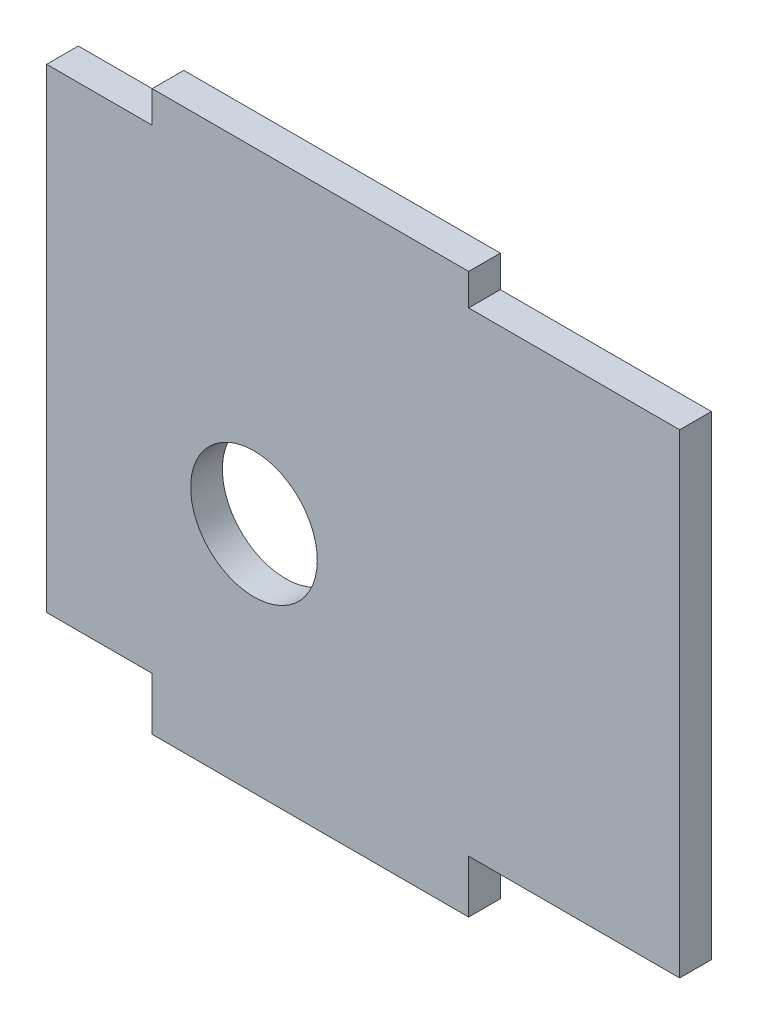
ISO-10303-21;
HEADER;
FILE_DESCRIPTION(('STEP AP214'),'2;1');
FILE_NAME('part.step','',(''),(''),'','','');
FILE_SCHEMA(('AUTOMOTIVE_DESIGN { 1 0 10303 214 1 1 1 1 }'));
ENDSEC;
DATA;
#1=APPLICATION_CONTEXT('core data for automotive mechanical design processes');
#2=APPLICATION_PROTOCOL_DEFINITION('international standard','automotive_design',2000,#1);
#3=PRODUCT_CONTEXT('',#1,'mechanical');
#4=PRODUCT('Part','Part','',(#3));
#5=PRODUCT_RELATED_PRODUCT_CATEGORY('part','',(#4));
#6=PRODUCT_DEFINITION_FORMATION('','',#4);
#7=PRODUCT_DEFINITION_CONTEXT('part definition',#1,'design');
#8=PRODUCT_DEFINITION('design','',#6,#7);
#9=PRODUCT_DEFINITION_SHAPE('','',#8);
#10=(LENGTH_UNIT() NAMED_UNIT(*) SI_UNIT(.MILLI.,.METRE.));
#11=(NAMED_UNIT(*) PLANE_ANGLE_UNIT() SI_UNIT($,.RADIAN.));
#12=(NAMED_UNIT(*) SI_UNIT($,.STERADIAN.) SOLID_ANGLE_UNIT());
#13=UNCERTAINTY_MEASURE_WITH_UNIT(LENGTH_MEASURE(1.E-05),#10,'distance_accuracy_value','');
#14=(GEOMETRIC_REPRESENTATION_CONTEXT(3) GLOBAL_UNCERTAINTY_ASSIGNED_CONTEXT((#13)) GLOBAL_UNIT_ASSIGNED_CONTEXT((#10,
#11,#12)) REPRESENTATION_CONTEXT('',''));
#15=CARTESIAN_POINT('',(0.,0.,0.));
#16=DIRECTION('',(0.,0.,1.));
#17=DIRECTION('',(1.,0.,0.));
#18=AXIS2_PLACEMENT_3D('',#15,#16,#17);
#19=CARTESIAN_POINT('',(47.5,3.,3.));
#20=DIRECTION('',(-1.,0.,0.));
#21=DIRECTION('',(0.,-1.,0.));
#22=AXIS2_PLACEMENT_3D('',#19,#20,#21);
#23=PLANE('',#22);
#24=DIRECTION('',(0.,0.,1.));
#25=VECTOR('',#24,1.);
#26=CARTESIAN_POINT('',(47.5,0.,-49.2442890089805));
#27=LINE('',#26,#25);
#28=CARTESIAN_POINT('',(47.5,0.,0.));
#29=VERTEX_POINT('',#28);
#30=CARTESIAN_POINT('',(47.5,0.,3.));
#31=VERTEX_POINT('',#30);
#32=EDGE_CURVE('E63',#29,#31,#27,.T.);
#33=ORIENTED_EDGE('',*,*,#32,.F.);
#34=DIRECTION('',(0.,1.,0.));
#35=VECTOR('',#34,1.);
#36=CARTESIAN_POINT('',(47.5,3.,0.));
#37=LINE('',#36,#35);
#38=CARTESIAN_POINT('',(47.5,3.,0.));
#39=VERTEX_POINT('',#38);
#40=EDGE_CURVE('E222',#29,#39,#37,.T.);
#41=ORIENTED_EDGE('',*,*,#40,.T.);
#42=DIRECTION('',(0.,0.,-1.));
#43=VECTOR('',#42,1.);
#44=CARTESIAN_POINT('',(47.5,3.,3.));
#45=LINE('',#44,#43);
#46=CARTESIAN_POINT('',(47.5,3.,3.));
#47=VERTEX_POINT('',#46);
#48=EDGE_CURVE('E237',#47,#39,#45,.T.);
#49=ORIENTED_EDGE('',*,*,#48,.F.);
#50=DIRECTION('',(0.,1.,0.));
#51=VECTOR('',#50,1.);
#52=CARTESIAN_POINT('',(47.5,3.,3.));
#53=LINE('',#52,#51);
#54=EDGE_CURVE('E273',#31,#47,#53,.T.);
#55=ORIENTED_EDGE('',*,*,#54,.F.);
#56=EDGE_LOOP('',(#33,#41,#49,#55));
#57=FACE_BOUND('',#56,.T.);
#58=ADVANCED_FACE('F38',(#57),#23,.F.);
#59=CARTESIAN_POINT('',(17.5,3.,3.));
#60=DIRECTION('',(1.,0.,0.));
#61=DIRECTION('',(0.,0.,-1.));
#62=AXIS2_PLACEMENT_3D('',#59,#60,#61);
#63=PLANE('',#62);
#64=DIRECTION('',(0.,0.,1.));
#65=VECTOR('',#64,1.);
#66=CARTESIAN_POINT('',(17.5,-45.,-49.2442890089805));
#67=LINE('',#66,#65);
#68=CARTESIAN_POINT('',(17.5,-45.,0.));
#69=VERTEX_POINT('',#68);
#70=CARTESIAN_POINT('',(17.5,-45.,3.));
#71=VERTEX_POINT('',#70);
#72=EDGE_CURVE('E169',#69,#71,#67,.T.);
#73=ORIENTED_EDGE('',*,*,#72,.F.);
#74=DIRECTION('',(0.,-1.,0.));
#75=VECTOR('',#74,1.);
#76=CARTESIAN_POINT('',(17.5,3.,0.));
#77=LINE('',#76,#75);
#78=CARTESIAN_POINT('',(17.5,-50.,0.));
#79=VERTEX_POINT('',#78);
#80=EDGE_CURVE('E197',#69,#79,#77,.T.);
#81=ORIENTED_EDGE('',*,*,#80,.T.);
#82=DIRECTION('',(0.,0.,-1.));
#83=VECTOR('',#82,1.);
#84=CARTESIAN_POINT('',(17.5,-50.,3.));
#85=LINE('',#84,#83);
#86=CARTESIAN_POINT('',(17.5,-50.,3.));
#87=VERTEX_POINT('',#86);
#88=EDGE_CURVE('E11',#87,#79,#85,.T.);
#89=ORIENTED_EDGE('',*,*,#88,.F.);
#90=DIRECTION('',(0.,-1.,0.));
#91=VECTOR('',#90,1.);
#92=CARTESIAN_POINT('',(17.5,3.,3.));
#93=LINE('',#92,#91);
#94=EDGE_CURVE('E183',#71,#87,#93,.T.);
#95=ORIENTED_EDGE('',*,*,#94,.F.);
#96=EDGE_LOOP('',(#73,#81,#89,#95));
#97=FACE_BOUND('',#96,.T.);
#98=ADVANCED_FACE('F296',(#97),#63,.F.);
#99=CARTESIAN_POINT('',(17.5,3.,0.));
#100=VERTEX_POINT('',#99);
#101=CARTESIAN_POINT('',(17.5,0.,0.));
#102=VERTEX_POINT('',#101);
#103=EDGE_CURVE('E214',#100,#102,#77,.T.);
#104=ORIENTED_EDGE('',*,*,#103,.T.);
#105=DIRECTION('',(0.,0.,1.));
#106=VECTOR('',#105,1.);
#107=CARTESIAN_POINT('',(17.5,0.,-49.2442890089805));
#108=LINE('',#107,#106);
#109=CARTESIAN_POINT('',(17.5,0.,3.));
#110=VERTEX_POINT('',#109);
#111=EDGE_CURVE('E188',#102,#110,#108,.T.);
#112=ORIENTED_EDGE('',*,*,#111,.T.);
#113=CARTESIAN_POINT('',(17.5,3.,3.));
#114=VERTEX_POINT('',#113);
#115=EDGE_CURVE('E210',#114,#110,#93,.T.);
#116=ORIENTED_EDGE('',*,*,#115,.F.);
#117=DIRECTION('',(0.,0.,-1.));
#118=VECTOR('',#117,1.);
#119=CARTESIAN_POINT('',(17.5,3.,3.));
#120=LINE('',#119,#118);
#121=EDGE_CURVE('E246',#114,#100,#120,.T.);
#122=ORIENTED_EDGE('',*,*,#121,.T.);
#123=EDGE_LOOP('',(#104,#112,#116,#122));
#124=FACE_BOUND('',#123,.T.);
#125=ADVANCED_FACE('F40',(#124),#63,.F.);
#126=CARTESIAN_POINT('',(17.5,-50.,3.));
#127=DIRECTION('',(0.,1.,0.));
#128=DIRECTION('',(0.,0.,1.));
#129=AXIS2_PLACEMENT_3D('',#126,#127,#128);
#130=PLANE('',#129);
#131=DIRECTION('',(1.,0.,0.));
#132=VECTOR('',#131,1.);
#133=CARTESIAN_POINT('',(17.5,-50.,0.));
#134=LINE('',#133,#132);
#135=CARTESIAN_POINT('',(47.5,-50.,0.));
#136=VERTEX_POINT('',#135);
#137=EDGE_CURVE('E219',#79,#136,#134,.T.);
#138=ORIENTED_EDGE('',*,*,#137,.T.);
#139=DIRECTION('',(0.,0.,-1.));
#140=VECTOR('',#139,1.);
#141=CARTESIAN_POINT('',(47.5,-50.,3.));
#142=LINE('',#141,#140);
#143=CARTESIAN_POINT('',(47.5,-50.,3.));
#144=VERTEX_POINT('',#143);
#145=EDGE_CURVE('E47',#144,#136,#142,.T.);
#146=ORIENTED_EDGE('',*,*,#145,.F.);
#147=DIRECTION('',(1.,0.,0.));
#148=VECTOR('',#147,1.);
#149=CARTESIAN_POINT('',(17.5,-50.,3.));
#150=LINE('',#149,#148);
#151=EDGE_CURVE('E207',#87,#144,#150,.T.);
#152=ORIENTED_EDGE('',*,*,#151,.F.);
#153=ORIENTED_EDGE('',*,*,#88,.T.);
#154=EDGE_LOOP('',(#138,#146,#152,#153));
#155=FACE_BOUND('',#154,.T.);
#156=ADVANCED_FACE('F303',(#155),#130,.F.);
#157=CARTESIAN_POINT('',(47.5,-45.,0.));
#158=VERTEX_POINT('',#157);
#159=EDGE_CURVE('E231',#136,#158,#37,.T.);
#160=ORIENTED_EDGE('',*,*,#159,.T.);
#161=DIRECTION('',(0.,0.,1.));
#162=VECTOR('',#161,1.);
#163=CARTESIAN_POINT('',(47.5,-45.,-49.2442890089805));
#164=LINE('',#163,#162);
#165=CARTESIAN_POINT('',(47.5,-45.,3.));
#166=VERTEX_POINT('',#165);
#167=EDGE_CURVE('E55',#158,#166,#164,.T.);
#168=ORIENTED_EDGE('',*,*,#167,.T.);
#169=EDGE_CURVE('E153',#144,#166,#53,.T.);
#170=ORIENTED_EDGE('',*,*,#169,.F.);
#171=ORIENTED_EDGE('',*,*,#145,.T.);
#172=EDGE_LOOP('',(#160,#168,#170,#171));
#173=FACE_BOUND('',#172,.T.);
#174=ADVANCED_FACE('F256',(#173),#23,.F.);
#175=CARTESIAN_POINT('',(17.5,3.,3.));
#176=DIRECTION('',(0.,-1.,0.));
#177=DIRECTION('',(0.,0.,-1.));
#178=AXIS2_PLACEMENT_3D('',#175,#176,#177);
#179=PLANE('',#178);
#180=DIRECTION('',(-1.,0.,0.));
#181=VECTOR('',#180,1.);
#182=CARTESIAN_POINT('',(17.5,3.,0.));
#183=LINE('',#182,#181);
#184=EDGE_CURVE('E225',#39,#100,#183,.T.);
#185=ORIENTED_EDGE('',*,*,#184,.T.);
#186=ORIENTED_EDGE('',*,*,#121,.F.);
#187=DIRECTION('',(-1.,0.,0.));
#188=VECTOR('',#187,1.);
#189=CARTESIAN_POINT('',(17.5,3.,3.));
#190=LINE('',#189,#188);
#191=EDGE_CURVE('E218',#47,#114,#190,.T.);
#192=ORIENTED_EDGE('',*,*,#191,.F.);
#193=ORIENTED_EDGE('',*,*,#48,.T.);
#194=EDGE_LOOP('',(#185,#186,#192,#193));
#195=FACE_BOUND('',#194,.T.);
#196=ADVANCED_FACE('F243',(#195),#179,.F.);
#197=CARTESIAN_POINT('',(0.,0.,3.));
#198=DIRECTION('',(0.,0.,1.));
#199=DIRECTION('',(1.,0.,0.));
#200=AXIS2_PLACEMENT_3D('',#197,#198,#199);
#201=PLANE('',#200);
#202=CARTESIAN_POINT('',(27.15,-27.9,3.));
#203=DIRECTION('',(0.,0.,1.));
#204=DIRECTION('',(1.,0.,0.));
#205=AXIS2_PLACEMENT_3D('',#202,#203,#204);
#206=CIRCLE('',#205,6.00000000000001);
#207=CARTESIAN_POINT('',(33.15,-27.9,3.));
#208=VERTEX_POINT('',#207);
#209=EDGE_CURVE('E156',#208,#208,#206,.T.);
#210=ORIENTED_EDGE('',*,*,#209,.F.);
#211=EDGE_LOOP('',(#210));
#212=FACE_BOUND('',#211,.T.);
#213=ORIENTED_EDGE('',*,*,#115,.T.);
#214=DIRECTION('',(-1.,0.,0.));
#215=VECTOR('',#214,1.);
#216=CARTESIAN_POINT('',(17.5,0.,3.));
#217=LINE('',#216,#215);
#218=CARTESIAN_POINT('',(7.49999999999997,0.,3.));
#219=VERTEX_POINT('',#218);
#220=EDGE_CURVE('E174',#110,#219,#217,.T.);
#221=ORIENTED_EDGE('',*,*,#220,.T.);
#222=DIRECTION('',(0.,-1.,0.));
#223=VECTOR('',#222,1.);
#224=CARTESIAN_POINT('',(7.49999999999997,0.,3.));
#225=LINE('',#224,#223);
#226=CARTESIAN_POINT('',(7.49999999999998,-45.,3.));
#227=VERTEX_POINT('',#226);
#228=EDGE_CURVE('E170',#219,#227,#225,.T.);
#229=ORIENTED_EDGE('',*,*,#228,.T.);
#230=DIRECTION('',(1.,0.,0.));
#231=VECTOR('',#230,1.);
#232=CARTESIAN_POINT('',(17.5,-45.,3.));
#233=LINE('',#232,#231);
#234=EDGE_CURVE('E173',#227,#71,#233,.T.);
#235=ORIENTED_EDGE('',*,*,#234,.T.);
#236=ORIENTED_EDGE('',*,*,#94,.T.);
#237=ORIENTED_EDGE('',*,*,#151,.T.);
#238=ORIENTED_EDGE('',*,*,#169,.T.);
#239=DIRECTION('',(1.,0.,0.));
#240=VECTOR('',#239,1.);
#241=CARTESIAN_POINT('',(47.5,-45.,3.));
#242=LINE('',#241,#240);
#243=CARTESIAN_POINT('',(67.5,-45.,3.));
#244=VERTEX_POINT('',#243);
#245=EDGE_CURVE('E135',#166,#244,#242,.T.);
#246=ORIENTED_EDGE('',*,*,#245,.T.);
#247=DIRECTION('',(0.,1.,0.));
#248=VECTOR('',#247,1.);
#249=CARTESIAN_POINT('',(67.5,0.,3.));
#250=LINE('',#249,#248);
#251=CARTESIAN_POINT('',(67.5,0.,3.));
#252=VERTEX_POINT('',#251);
#253=EDGE_CURVE('E143',#244,#252,#250,.T.);
#254=ORIENTED_EDGE('',*,*,#253,.T.);
#255=DIRECTION('',(-1.,0.,0.));
#256=VECTOR('',#255,1.);
#257=CARTESIAN_POINT('',(47.5,0.,3.));
#258=LINE('',#257,#256);
#259=EDGE_CURVE('E149',#252,#31,#258,.T.);
#260=ORIENTED_EDGE('',*,*,#259,.T.);
#261=ORIENTED_EDGE('',*,*,#54,.T.);
#262=ORIENTED_EDGE('',*,*,#191,.T.);
#263=EDGE_LOOP('',(#213,#221,#229,#235,#236,#237,#238,#246,#254,#260,#261,#262));
#264=FACE_BOUND('',#263,.T.);
#265=ADVANCED_FACE('F152',(#212,#264),#201,.T.);
#266=CARTESIAN_POINT('',(0.,0.,0.));
#267=DIRECTION('',(0.,0.,1.));
#268=DIRECTION('',(1.,0.,0.));
#269=AXIS2_PLACEMENT_3D('',#266,#267,#268);
#270=PLANE('',#269);
#271=CARTESIAN_POINT('',(27.15,-27.9,0.));
#272=DIRECTION('',(0.,0.,1.));
#273=DIRECTION('',(1.,0.,0.));
#274=AXIS2_PLACEMENT_3D('',#271,#272,#273);
#275=CIRCLE('',#274,6.00000000000001);
#276=CARTESIAN_POINT('',(33.15,-27.9,0.));
#277=VERTEX_POINT('',#276);
#278=EDGE_CURVE('E42',#277,#277,#275,.T.);
#279=ORIENTED_EDGE('',*,*,#278,.T.);
#280=EDGE_LOOP('',(#279));
#281=FACE_BOUND('',#280,.T.);
#282=ORIENTED_EDGE('',*,*,#103,.F.);
#283=ORIENTED_EDGE('',*,*,#184,.F.);
#284=ORIENTED_EDGE('',*,*,#40,.F.);
#285=DIRECTION('',(1.,0.,0.));
#286=VECTOR('',#285,1.);
#287=CARTESIAN_POINT('',(47.5,0.,0.));
#288=LINE('',#287,#286);
#289=CARTESIAN_POINT('',(67.5,0.,0.));
#290=VERTEX_POINT('',#289);
#291=EDGE_CURVE('E262',#29,#290,#288,.T.);
#292=ORIENTED_EDGE('',*,*,#291,.T.);
#293=DIRECTION('',(0.,-1.,0.));
#294=VECTOR('',#293,1.);
#295=CARTESIAN_POINT('',(67.5,0.,0.));
#296=LINE('',#295,#294);
#297=CARTESIAN_POINT('',(67.5,-45.,0.));
#298=VERTEX_POINT('',#297);
#299=EDGE_CURVE('E261',#290,#298,#296,.T.);
#300=ORIENTED_EDGE('',*,*,#299,.T.);
#301=DIRECTION('',(-1.,0.,0.));
#302=VECTOR('',#301,1.);
#303=CARTESIAN_POINT('',(47.5,-45.,0.));
#304=LINE('',#303,#302);
#305=EDGE_CURVE('E137',#298,#158,#304,.T.);
#306=ORIENTED_EDGE('',*,*,#305,.T.);
#307=ORIENTED_EDGE('',*,*,#159,.F.);
#308=ORIENTED_EDGE('',*,*,#137,.F.);
#309=ORIENTED_EDGE('',*,*,#80,.F.);
#310=DIRECTION('',(-1.,0.,0.));
#311=VECTOR('',#310,1.);
#312=CARTESIAN_POINT('',(17.5,-45.,0.));
#313=LINE('',#312,#311);
#314=CARTESIAN_POINT('',(7.49999999999998,-45.,0.));
#315=VERTEX_POINT('',#314);
#316=EDGE_CURVE('E168',#69,#315,#313,.T.);
#317=ORIENTED_EDGE('',*,*,#316,.T.);
#318=DIRECTION('',(0.,1.,0.));
#319=VECTOR('',#318,1.);
#320=CARTESIAN_POINT('',(7.49999999999997,0.,0.));
#321=LINE('',#320,#319);
#322=CARTESIAN_POINT('',(7.49999999999997,0.,0.));
#323=VERTEX_POINT('',#322);
#324=EDGE_CURVE('E166',#315,#323,#321,.T.);
#325=ORIENTED_EDGE('',*,*,#324,.T.);
#326=DIRECTION('',(1.,0.,0.));
#327=VECTOR('',#326,1.);
#328=CARTESIAN_POINT('',(17.5,0.,0.));
#329=LINE('',#328,#327);
#330=EDGE_CURVE('E192',#323,#102,#329,.T.);
#331=ORIENTED_EDGE('',*,*,#330,.T.);
#332=EDGE_LOOP('',(#282,#283,#284,#292,#300,#306,#307,#308,#309,#317,#325,#331));
#333=FACE_BOUND('',#332,.T.);
#334=ADVANCED_FACE('F249',(#281,#333),#270,.F.);
#335=CARTESIAN_POINT('',(17.5,-45.,-49.2442890089805));
#336=DIRECTION('',(0.,-1.,0.));
#337=DIRECTION('',(0.,0.,-1.));
#338=AXIS2_PLACEMENT_3D('',#335,#336,#337);
#339=PLANE('',#338);
#340=ORIENTED_EDGE('',*,*,#316,.F.);
#341=ORIENTED_EDGE('',*,*,#72,.T.);
#342=ORIENTED_EDGE('',*,*,#234,.F.);
#343=DIRECTION('',(0.,0.,1.));
#344=VECTOR('',#343,1.);
#345=CARTESIAN_POINT('',(7.49999999999998,-45.,-49.2442890089805));
#346=LINE('',#345,#344);
#347=EDGE_CURVE('E177',#315,#227,#346,.T.);
#348=ORIENTED_EDGE('',*,*,#347,.F.);
#349=EDGE_LOOP('',(#340,#341,#342,#348));
#350=FACE_BOUND('',#349,.T.);
#351=ADVANCED_FACE('F289',(#350),#339,.T.);
#352=CARTESIAN_POINT('',(7.49999999999997,0.,-49.2442890089805));
#353=DIRECTION('',(-1.,0.,0.));
#354=DIRECTION('',(0.,-1.,0.));
#355=AXIS2_PLACEMENT_3D('',#352,#353,#354);
#356=PLANE('',#355);
#357=ORIENTED_EDGE('',*,*,#324,.F.);
#358=ORIENTED_EDGE('',*,*,#347,.T.);
#359=ORIENTED_EDGE('',*,*,#228,.F.);
#360=DIRECTION('',(0.,0.,1.));
#361=VECTOR('',#360,1.);
#362=CARTESIAN_POINT('',(7.49999999999997,0.,-49.2442890089805));
#363=LINE('',#362,#361);
#364=EDGE_CURVE('E202',#323,#219,#363,.T.);
#365=ORIENTED_EDGE('',*,*,#364,.F.);
#366=EDGE_LOOP('',(#357,#358,#359,#365));
#367=FACE_BOUND('',#366,.T.);
#368=ADVANCED_FACE('F322',(#367),#356,.T.);
#369=CARTESIAN_POINT('',(17.5,0.,-49.2442890089805));
#370=DIRECTION('',(0.,1.,0.));
#371=DIRECTION('',(-1.,0.,0.));
#372=AXIS2_PLACEMENT_3D('',#369,#370,#371);
#373=PLANE('',#372);
#374=ORIENTED_EDGE('',*,*,#330,.F.);
#375=ORIENTED_EDGE('',*,*,#364,.T.);
#376=ORIENTED_EDGE('',*,*,#220,.F.);
#377=ORIENTED_EDGE('',*,*,#111,.F.);
#378=EDGE_LOOP('',(#374,#375,#376,#377));
#379=FACE_BOUND('',#378,.T.);
#380=ADVANCED_FACE('F321',(#379),#373,.T.);
#381=CARTESIAN_POINT('',(47.5,0.,-49.2442890089805));
#382=DIRECTION('',(0.,1.,0.));
#383=DIRECTION('',(0.,0.,1.));
#384=AXIS2_PLACEMENT_3D('',#381,#382,#383);
#385=PLANE('',#384);
#386=ORIENTED_EDGE('',*,*,#291,.F.);
#387=ORIENTED_EDGE('',*,*,#32,.T.);
#388=ORIENTED_EDGE('',*,*,#259,.F.);
#389=DIRECTION('',(0.,0.,1.));
#390=VECTOR('',#389,1.);
#391=CARTESIAN_POINT('',(67.5,0.,-49.2442890089805));
#392=LINE('',#391,#390);
#393=EDGE_CURVE('E140',#290,#252,#392,.T.);
#394=ORIENTED_EDGE('',*,*,#393,.F.);
#395=EDGE_LOOP('',(#386,#387,#388,#394));
#396=FACE_BOUND('',#395,.T.);
#397=ADVANCED_FACE('F326',(#396),#385,.T.);
#398=CARTESIAN_POINT('',(67.5,0.,-49.2442890089805));
#399=DIRECTION('',(1.,0.,0.));
#400=DIRECTION('',(0.,0.,-1.));
#401=AXIS2_PLACEMENT_3D('',#398,#399,#400);
#402=PLANE('',#401);
#403=ORIENTED_EDGE('',*,*,#299,.F.);
#404=ORIENTED_EDGE('',*,*,#393,.T.);
#405=ORIENTED_EDGE('',*,*,#253,.F.);
#406=DIRECTION('',(0.,0.,1.));
#407=VECTOR('',#406,1.);
#408=CARTESIAN_POINT('',(67.5,-45.,-49.2442890089805));
#409=LINE('',#408,#407);
#410=EDGE_CURVE('E131',#298,#244,#409,.T.);
#411=ORIENTED_EDGE('',*,*,#410,.F.);
#412=EDGE_LOOP('',(#403,#404,#405,#411));
#413=FACE_BOUND('',#412,.T.);
#414=ADVANCED_FACE('F144',(#413),#402,.T.);
#415=CARTESIAN_POINT('',(47.5,-45.,-49.2442890089805));
#416=DIRECTION('',(0.,-1.,0.));
#417=DIRECTION('',(0.,0.,-1.));
#418=AXIS2_PLACEMENT_3D('',#415,#416,#417);
#419=PLANE('',#418);
#420=ORIENTED_EDGE('',*,*,#305,.F.);
#421=ORIENTED_EDGE('',*,*,#410,.T.);
#422=ORIENTED_EDGE('',*,*,#245,.F.);
#423=ORIENTED_EDGE('',*,*,#167,.F.);
#424=EDGE_LOOP('',(#420,#421,#422,#423));
#425=FACE_BOUND('',#424,.T.);
#426=ADVANCED_FACE('F133',(#425),#419,.T.);
#427=CARTESIAN_POINT('',(27.15,-27.9,-5.00000000001367E-05));
#428=DIRECTION('',(0.,0.,1.));
#429=DIRECTION('',(1.,0.,0.));
#430=AXIS2_PLACEMENT_3D('',#427,#428,#429);
#431=CYLINDRICAL_SURFACE('',#430,6.00000000000001);
#432=CARTESIAN_POINT('',(33.15,-27.9,3.));
#433=CARTESIAN_POINT('',(33.15,-27.9,2.96875));
#434=CARTESIAN_POINT('',(33.15,-27.9,2.9375));
#435=CARTESIAN_POINT('',(33.15,-27.9,2.875));
#436=CARTESIAN_POINT('',(33.15,-27.9,2.84375));
#437=CARTESIAN_POINT('',(33.15,-27.9,2.78125));
#438=CARTESIAN_POINT('',(33.15,-27.9,2.75));
#439=CARTESIAN_POINT('',(33.15,-27.9,2.6875));
#440=CARTESIAN_POINT('',(33.15,-27.9,2.65625));
#441=CARTESIAN_POINT('',(33.15,-27.9,2.59375));
#442=CARTESIAN_POINT('',(33.15,-27.9,2.5625));
#443=CARTESIAN_POINT('',(33.15,-27.9,2.5));
#444=CARTESIAN_POINT('',(33.15,-27.9,2.46875));
#445=CARTESIAN_POINT('',(33.15,-27.9,2.40625));
#446=CARTESIAN_POINT('',(33.15,-27.9,2.375));
#447=CARTESIAN_POINT('',(33.15,-27.9,2.3125));
#448=CARTESIAN_POINT('',(33.15,-27.9,2.28125));
#449=CARTESIAN_POINT('',(33.15,-27.9,2.21875));
#450=CARTESIAN_POINT('',(33.15,-27.9,2.1875));
#451=CARTESIAN_POINT('',(33.15,-27.9,2.125));
#452=CARTESIAN_POINT('',(33.15,-27.9,2.09375));
#453=CARTESIAN_POINT('',(33.15,-27.9,2.03125));
#454=CARTESIAN_POINT('',(33.15,-27.9,2.));
#455=CARTESIAN_POINT('',(33.15,-27.9,1.9375));
#456=CARTESIAN_POINT('',(33.15,-27.9,1.90625));
#457=CARTESIAN_POINT('',(33.15,-27.9,1.84375));
#458=CARTESIAN_POINT('',(33.15,-27.9,1.8125));
#459=CARTESIAN_POINT('',(33.15,-27.9,1.75));
#460=CARTESIAN_POINT('',(33.15,-27.9,1.71875));
#461=CARTESIAN_POINT('',(33.15,-27.9,1.65625));
#462=CARTESIAN_POINT('',(33.15,-27.9,1.625));
#463=CARTESIAN_POINT('',(33.15,-27.9,1.5625));
#464=CARTESIAN_POINT('',(33.15,-27.9,1.53125));
#465=CARTESIAN_POINT('',(33.15,-27.9,1.46875));
#466=CARTESIAN_POINT('',(33.15,-27.9,1.4375));
#467=CARTESIAN_POINT('',(33.15,-27.9,1.375));
#468=CARTESIAN_POINT('',(33.15,-27.9,1.34375));
#469=CARTESIAN_POINT('',(33.15,-27.9,1.28125));
#470=CARTESIAN_POINT('',(33.15,-27.9,1.25));
#471=CARTESIAN_POINT('',(33.15,-27.9,1.1875));
#472=CARTESIAN_POINT('',(33.15,-27.9,1.15625));
#473=CARTESIAN_POINT('',(33.15,-27.9,1.09375));
#474=CARTESIAN_POINT('',(33.15,-27.9,1.0625));
#475=CARTESIAN_POINT('',(33.15,-27.9,1.));
#476=CARTESIAN_POINT('',(33.15,-27.9,0.96875));
#477=CARTESIAN_POINT('',(33.15,-27.9,0.90625));
#478=CARTESIAN_POINT('',(33.15,-27.9,0.875));
#479=CARTESIAN_POINT('',(33.15,-27.9,0.8125));
#480=CARTESIAN_POINT('',(33.15,-27.9,0.78125));
#481=CARTESIAN_POINT('',(33.15,-27.9,0.71875));
#482=CARTESIAN_POINT('',(33.15,-27.9,0.6875));
#483=CARTESIAN_POINT('',(33.15,-27.9,0.625));
#484=CARTESIAN_POINT('',(33.15,-27.9,0.59375));
#485=CARTESIAN_POINT('',(33.15,-27.9,0.53125));
#486=CARTESIAN_POINT('',(33.15,-27.9,0.5));
#487=CARTESIAN_POINT('',(33.15,-27.9,0.4375));
#488=CARTESIAN_POINT('',(33.15,-27.9,0.40625));
#489=CARTESIAN_POINT('',(33.15,-27.9,0.34375));
#490=CARTESIAN_POINT('',(33.15,-27.9,0.3125));
#491=CARTESIAN_POINT('',(33.15,-27.9,0.25));
#492=CARTESIAN_POINT('',(33.15,-27.9,0.21875));
#493=CARTESIAN_POINT('',(33.15,-27.9,0.15625));
#494=CARTESIAN_POINT('',(33.15,-27.9,0.125));
#495=CARTESIAN_POINT('',(33.15,-27.9,0.0625000000000001));
#496=CARTESIAN_POINT('',(33.15,-27.9,0.03125));
#497=CARTESIAN_POINT('',(33.15,-27.9,0.));
#498=B_SPLINE_CURVE_WITH_KNOTS('',3,(#432,#433,#434,#435,#436,#437,#438,#439,#440,#441,#442,
#443,#444,#445,#446,#447,#448,#449,#450,#451,#452,#453,#454,#455,#456,#457,#458,#459,#460,#461,
#462,#463,#464,#465,#466,#467,#468,#469,#470,#471,#472,#473,#474,#475,#476,#477,#478,#479,#480,
#481,#482,#483,#484,#485,#486,#487,#488,#489,#490,#491,#492,#493,#494,#495,#496,#497),
.UNSPECIFIED.,.F.,.F.,(4,2,2,2,2,2,2,2,2,2,2,2,2,2,2,2,2,2,2,2,2,2,2,2,2,2,2,2,2,2,2,2,4),(0.,
0.0937500000000001,0.1875,0.28125,0.375,0.46875,0.5625,0.65625,0.75,0.84375,0.9375,1.03125,
1.125,1.21875,1.3125,1.40625,1.5,1.59375,1.6875,1.78125,1.875,1.96875,2.0625,2.15625,2.25,
2.34375,2.4375,2.53125,2.625,2.71875,2.8125,2.90625,3.),.UNSPECIFIED.);
#499=EDGE_CURVE('BSEAM280',#208,#277,#498,.T.);
#500=ORIENTED_EDGE('',*,*,#209,.T.);
#501=ORIENTED_EDGE('',*,*,#278,.F.);
#502=ORIENTED_EDGE('',*,*,#499,.T.);
#503=ORIENTED_EDGE('',*,*,#499,.F.);
#504=EDGE_LOOP('',(#500,#502,#501,#503));
#505=FACE_BOUND('',#504,.T.);
#506=ADVANCED_FACE('F280',(#505),#431,.F.);
#507=CLOSED_SHELL('',(#58,#98,#125,#156,#174,#196,#265,#334,#351,#368,#380,#397,#414,#426,#506));
#508=MANIFOLD_SOLID_BREP('B2',#507);
#509=ADVANCED_BREP_SHAPE_REPRESENTATION('',(#18,#508),#14);
#510=SHAPE_DEFINITION_REPRESENTATION(#9,#509);
ENDSEC;
END-ISO-10303-21;
